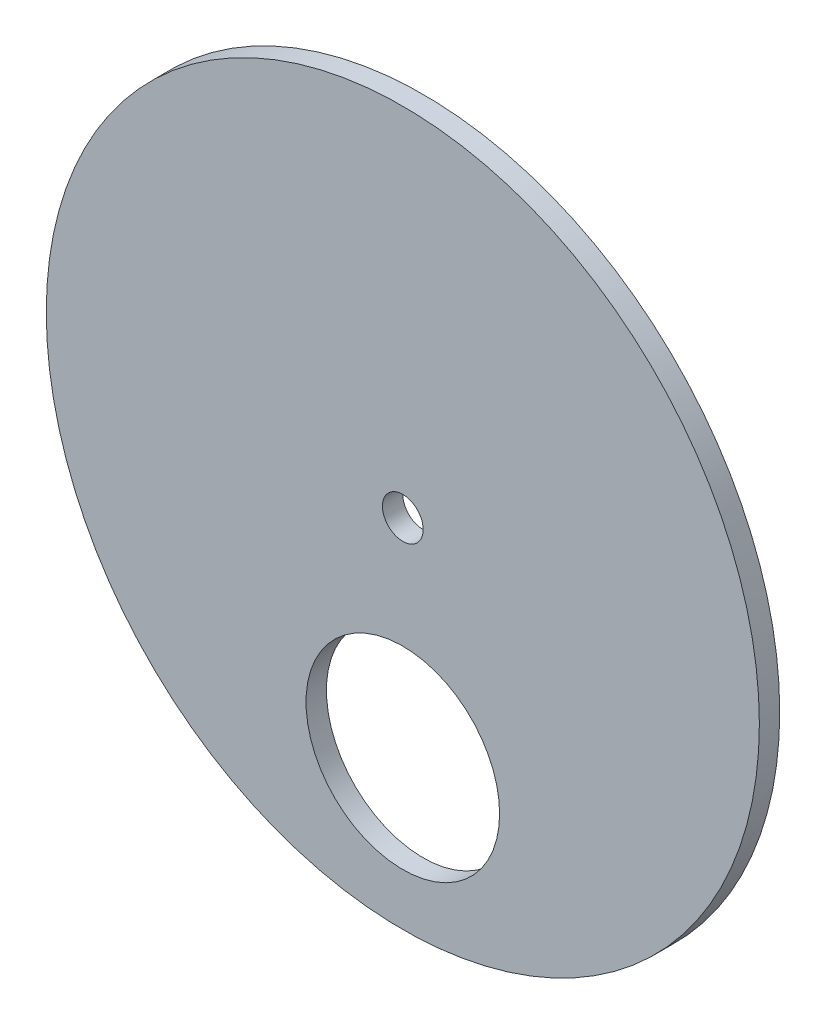
ISO-10303-21;
HEADER;
FILE_DESCRIPTION(('STEP AP214'),'2;1');
FILE_NAME('part.step','',(''),(''),'','','');
FILE_SCHEMA(('AUTOMOTIVE_DESIGN { 1 0 10303 214 1 1 1 1 }'));
ENDSEC;
DATA;
#1=APPLICATION_CONTEXT('core data for automotive mechanical design processes');
#2=APPLICATION_PROTOCOL_DEFINITION('international standard','automotive_design',2000,#1);
#3=PRODUCT_CONTEXT('',#1,'mechanical');
#4=PRODUCT('Part','Part','',(#3));
#5=PRODUCT_RELATED_PRODUCT_CATEGORY('part','',(#4));
#6=PRODUCT_DEFINITION_FORMATION('','',#4);
#7=PRODUCT_DEFINITION_CONTEXT('part definition',#1,'design');
#8=PRODUCT_DEFINITION('design','',#6,#7);
#9=PRODUCT_DEFINITION_SHAPE('','',#8);
#10=(LENGTH_UNIT() NAMED_UNIT(*) SI_UNIT(.MILLI.,.METRE.));
#11=(NAMED_UNIT(*) PLANE_ANGLE_UNIT() SI_UNIT($,.RADIAN.));
#12=(NAMED_UNIT(*) SI_UNIT($,.STERADIAN.) SOLID_ANGLE_UNIT());
#13=UNCERTAINTY_MEASURE_WITH_UNIT(LENGTH_MEASURE(1.E-05),#10,'distance_accuracy_value','');
#14=(GEOMETRIC_REPRESENTATION_CONTEXT(3) GLOBAL_UNCERTAINTY_ASSIGNED_CONTEXT((#13)) GLOBAL_UNIT_ASSIGNED_CONTEXT((#10,
#11,#12)) REPRESENTATION_CONTEXT('',''));
#15=CARTESIAN_POINT('',(0.,0.,0.));
#16=DIRECTION('',(0.,0.,1.));
#17=DIRECTION('',(1.,0.,0.));
#18=AXIS2_PLACEMENT_3D('',#15,#16,#17);
#19=CARTESIAN_POINT('',(0.,0.,10.));
#20=DIRECTION('',(0.,0.,-1.));
#21=DIRECTION('',(-1.,0.,0.));
#22=AXIS2_PLACEMENT_3D('',#19,#20,#21);
#23=CYLINDRICAL_SURFACE('',#22,175.);
#24=CARTESIAN_POINT('',(0.,0.,10.));
#25=DIRECTION('',(0.,0.,1.));
#26=DIRECTION('',(1.,0.,0.));
#27=AXIS2_PLACEMENT_3D('',#24,#25,#26);
#28=CIRCLE('',#27,175.);
#29=CARTESIAN_POINT('',(175.,0.,10.));
#30=VERTEX_POINT('',#29);
#31=EDGE_CURVE('E41',#30,#30,#28,.T.);
#32=ORIENTED_EDGE('',*,*,#31,.F.);
#33=EDGE_LOOP('',(#32));
#34=FACE_BOUND('',#33,.T.);
#35=CARTESIAN_POINT('',(0.,0.,0.));
#36=DIRECTION('',(0.,0.,1.));
#37=DIRECTION('',(1.,0.,0.));
#38=AXIS2_PLACEMENT_3D('',#35,#36,#37);
#39=CIRCLE('',#38,175.);
#40=CARTESIAN_POINT('',(175.,0.,0.));
#41=VERTEX_POINT('',#40);
#42=EDGE_CURVE('E52',#41,#41,#39,.T.);
#43=ORIENTED_EDGE('',*,*,#42,.T.);
#44=EDGE_LOOP('',(#43));
#45=FACE_BOUND('',#44,.T.);
#46=ADVANCED_FACE('F33',(#34,#45),#23,.T.);
#47=CARTESIAN_POINT('',(0.,-102.005245108662,10.));
#48=DIRECTION('',(0.,0.,-1.));
#49=DIRECTION('',(-1.,0.,0.));
#50=AXIS2_PLACEMENT_3D('',#47,#48,#49);
#51=CYLINDRICAL_SURFACE('',#50,47.5);
#52=CARTESIAN_POINT('',(0.,-102.005245108662,10.));
#53=DIRECTION('',(0.,0.,1.));
#54=DIRECTION('',(1.,0.,0.));
#55=AXIS2_PLACEMENT_3D('',#52,#53,#54);
#56=CIRCLE('',#55,47.5);
#57=CARTESIAN_POINT('',(47.5,-102.005245108662,10.));
#58=VERTEX_POINT('',#57);
#59=EDGE_CURVE('E46',#58,#58,#56,.T.);
#60=ORIENTED_EDGE('',*,*,#59,.T.);
#61=EDGE_LOOP('',(#60));
#62=FACE_BOUND('',#61,.T.);
#63=CARTESIAN_POINT('',(0.,-102.005245108662,0.));
#64=DIRECTION('',(0.,0.,1.));
#65=DIRECTION('',(1.,0.,0.));
#66=AXIS2_PLACEMENT_3D('',#63,#64,#65);
#67=CIRCLE('',#66,47.5);
#68=CARTESIAN_POINT('',(47.5,-102.005245108662,0.));
#69=VERTEX_POINT('',#68);
#70=EDGE_CURVE('E50',#69,#69,#67,.T.);
#71=ORIENTED_EDGE('',*,*,#70,.F.);
#72=EDGE_LOOP('',(#71));
#73=FACE_BOUND('',#72,.T.);
#74=ADVANCED_FACE('F35',(#62,#73),#51,.F.);
#75=CARTESIAN_POINT('',(0.,0.,10.));
#76=DIRECTION('',(0.,0.,-1.));
#77=DIRECTION('',(-1.,0.,0.));
#78=AXIS2_PLACEMENT_3D('',#75,#76,#77);
#79=CYLINDRICAL_SURFACE('',#78,10.);
#80=CARTESIAN_POINT('',(0.,0.,10.));
#81=DIRECTION('',(0.,0.,1.));
#82=DIRECTION('',(1.,0.,0.));
#83=AXIS2_PLACEMENT_3D('',#80,#81,#82);
#84=CIRCLE('',#83,10.);
#85=CARTESIAN_POINT('',(10.,0.,10.));
#86=VERTEX_POINT('',#85);
#87=EDGE_CURVE('E10',#86,#86,#84,.T.);
#88=ORIENTED_EDGE('',*,*,#87,.T.);
#89=EDGE_LOOP('',(#88));
#90=FACE_BOUND('',#89,.T.);
#91=CARTESIAN_POINT('',(0.,0.,0.));
#92=DIRECTION('',(0.,0.,1.));
#93=DIRECTION('',(1.,0.,0.));
#94=AXIS2_PLACEMENT_3D('',#91,#92,#93);
#95=CIRCLE('',#94,10.);
#96=CARTESIAN_POINT('',(10.,0.,0.));
#97=VERTEX_POINT('',#96);
#98=EDGE_CURVE('E37',#97,#97,#95,.T.);
#99=ORIENTED_EDGE('',*,*,#98,.F.);
#100=EDGE_LOOP('',(#99));
#101=FACE_BOUND('',#100,.T.);
#102=ADVANCED_FACE('F68',(#90,#101),#79,.F.);
#103=CARTESIAN_POINT('',(0.,0.,10.));
#104=DIRECTION('',(0.,0.,1.));
#105=DIRECTION('',(1.,0.,0.));
#106=AXIS2_PLACEMENT_3D('',#103,#104,#105);
#107=PLANE('',#106);
#108=ORIENTED_EDGE('',*,*,#59,.F.);
#109=EDGE_LOOP('',(#108));
#110=FACE_BOUND('',#109,.T.);
#111=ORIENTED_EDGE('',*,*,#31,.T.);
#112=EDGE_LOOP('',(#111));
#113=FACE_BOUND('',#112,.T.);
#114=ORIENTED_EDGE('',*,*,#87,.F.);
#115=EDGE_LOOP('',(#114));
#116=FACE_BOUND('',#115,.T.);
#117=ADVANCED_FACE('F64',(#110,#113,#116),#107,.T.);
#118=CARTESIAN_POINT('',(0.,0.,0.));
#119=DIRECTION('',(0.,0.,1.));
#120=DIRECTION('',(1.,0.,0.));
#121=AXIS2_PLACEMENT_3D('',#118,#119,#120);
#122=PLANE('',#121);
#123=ORIENTED_EDGE('',*,*,#70,.T.);
#124=EDGE_LOOP('',(#123));
#125=FACE_BOUND('',#124,.T.);
#126=ORIENTED_EDGE('',*,*,#42,.F.);
#127=EDGE_LOOP('',(#126));
#128=FACE_BOUND('',#127,.T.);
#129=ORIENTED_EDGE('',*,*,#98,.T.);
#130=EDGE_LOOP('',(#129));
#131=FACE_BOUND('',#130,.T.);
#132=ADVANCED_FACE('F67',(#125,#128,#131),#122,.F.);
#133=CLOSED_SHELL('',(#46,#74,#102,#117,#132));
#134=MANIFOLD_SOLID_BREP('B2',#133);
#135=ADVANCED_BREP_SHAPE_REPRESENTATION('',(#18,#134),#14);
#136=SHAPE_DEFINITION_REPRESENTATION(#9,#135);
ENDSEC;
END-ISO-10303-21;
